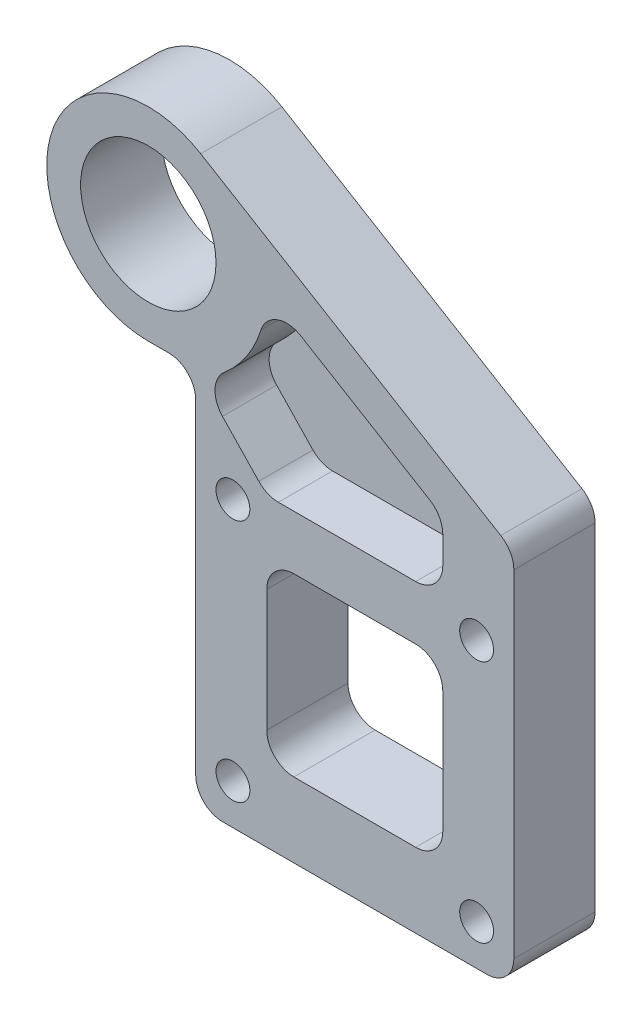
ISO-10303-21;
HEADER;
FILE_DESCRIPTION(('STEP AP214'),'2;1');
FILE_NAME('part.step','',(''),(''),'','','');
FILE_SCHEMA(('AUTOMOTIVE_DESIGN { 1 0 10303 214 1 1 1 1 }'));
ENDSEC;
DATA;
#1=APPLICATION_CONTEXT('core data for automotive mechanical design processes');
#2=APPLICATION_PROTOCOL_DEFINITION('international standard','automotive_design',2000,#1);
#3=PRODUCT_CONTEXT('',#1,'mechanical');
#4=PRODUCT('Part','Part','',(#3));
#5=PRODUCT_RELATED_PRODUCT_CATEGORY('part','',(#4));
#6=PRODUCT_DEFINITION_FORMATION('','',#4);
#7=PRODUCT_DEFINITION_CONTEXT('part definition',#1,'design');
#8=PRODUCT_DEFINITION('design','',#6,#7);
#9=PRODUCT_DEFINITION_SHAPE('','',#8);
#10=(LENGTH_UNIT() NAMED_UNIT(*) SI_UNIT(.MILLI.,.METRE.));
#11=(NAMED_UNIT(*) PLANE_ANGLE_UNIT() SI_UNIT($,.RADIAN.));
#12=(NAMED_UNIT(*) SI_UNIT($,.STERADIAN.) SOLID_ANGLE_UNIT());
#13=UNCERTAINTY_MEASURE_WITH_UNIT(LENGTH_MEASURE(1.E-05),#10,'distance_accuracy_value','');
#14=(GEOMETRIC_REPRESENTATION_CONTEXT(3) GLOBAL_UNCERTAINTY_ASSIGNED_CONTEXT((#13)) GLOBAL_UNIT_ASSIGNED_CONTEXT((#10,
#11,#12)) REPRESENTATION_CONTEXT('',''));
#15=CARTESIAN_POINT('',(0.,0.,0.));
#16=DIRECTION('',(0.,0.,1.));
#17=DIRECTION('',(1.,0.,0.));
#18=AXIS2_PLACEMENT_3D('',#15,#16,#17);
#19=CARTESIAN_POINT('',(0.,0.,6.));
#20=DIRECTION('',(0.,0.,1.));
#21=DIRECTION('',(1.,0.,0.));
#22=AXIS2_PLACEMENT_3D('',#19,#20,#21);
#23=PLANE('',#22);
#24=DIRECTION('',(0.,1.,0.));
#25=VECTOR('',#24,1.);
#26=CARTESIAN_POINT('',(-11.75,0.,6.));
#27=LINE('',#26,#25);
#28=CARTESIAN_POINT('',(-11.75,-10.,6.));
#29=VERTEX_POINT('',#28);
#30=CARTESIAN_POINT('',(-11.75,14.,6.));
#31=VERTEX_POINT('',#30);
#32=EDGE_CURVE('E267',#29,#31,#27,.T.);
#33=ORIENTED_EDGE('',*,*,#32,.F.);
#34=CARTESIAN_POINT('',(-9.75,-10.,6.));
#35=DIRECTION('',(0.,0.,1.));
#36=DIRECTION('',(1.,0.,0.));
#37=AXIS2_PLACEMENT_3D('',#34,#35,#36);
#38=CIRCLE('',#37,2.);
#39=CARTESIAN_POINT('',(-9.75,-12.,6.));
#40=VERTEX_POINT('',#39);
#41=EDGE_CURVE('E388',#29,#40,#38,.T.);
#42=ORIENTED_EDGE('',*,*,#41,.T.);
#43=DIRECTION('',(-1.,0.,0.));
#44=VECTOR('',#43,1.);
#45=CARTESIAN_POINT('',(-11.75,-12.,6.));
#46=LINE('',#45,#44);
#47=CARTESIAN_POINT('',(9.75,-12.,6.));
#48=VERTEX_POINT('',#47);
#49=EDGE_CURVE('E289',#48,#40,#46,.T.);
#50=ORIENTED_EDGE('',*,*,#49,.F.);
#51=CARTESIAN_POINT('',(9.75,-10.,6.));
#52=DIRECTION('',(0.,0.,1.));
#53=DIRECTION('',(1.,0.,0.));
#54=AXIS2_PLACEMENT_3D('',#51,#52,#53);
#55=CIRCLE('',#54,2.);
#56=CARTESIAN_POINT('',(11.75,-10.,6.));
#57=VERTEX_POINT('',#56);
#58=EDGE_CURVE('E385',#48,#57,#55,.T.);
#59=ORIENTED_EDGE('',*,*,#58,.T.);
#60=DIRECTION('',(0.,1.,0.));
#61=VECTOR('',#60,1.);
#62=CARTESIAN_POINT('',(11.75,0.,6.));
#63=LINE('',#62,#61);
#64=CARTESIAN_POINT('',(11.75,14.8695652173913,6.));
#65=VERTEX_POINT('',#64);
#66=EDGE_CURVE('E270',#57,#65,#63,.T.);
#67=ORIENTED_EDGE('',*,*,#66,.T.);
#68=CARTESIAN_POINT('',(9.75,14.8695652173913,6.));
#69=DIRECTION('',(0.,0.,1.));
#70=DIRECTION('',(1.,0.,0.));
#71=AXIS2_PLACEMENT_3D('',#68,#69,#70);
#72=CIRCLE('',#71,2.);
#73=CARTESIAN_POINT('',(10.7815186246418,16.5830322661019,6.));
#74=VERTEX_POINT('',#73);
#75=EDGE_CURVE('E256',#65,#74,#72,.T.);
#76=ORIENTED_EDGE('',*,*,#75,.T.);
#77=DIRECTION('',(0.856733524355301,-0.515759312320917,0.));
#78=VECTOR('',#77,1.);
#79=CARTESIAN_POINT('',(10.1954827957078,16.9358297550923,6.));
#80=LINE('',#79,#78);
#81=CARTESIAN_POINT('',(-11.3818051575931,29.9255014326648,6.));
#82=VERTEX_POINT('',#81);
#83=EDGE_CURVE('E234',#82,#74,#80,.T.);
#84=ORIENTED_EDGE('',*,*,#83,.F.);
#85=CARTESIAN_POINT('',(-15.25,23.5,6.));
#86=DIRECTION('',(0.,0.,1.));
#87=DIRECTION('',(1.,0.,0.));
#88=AXIS2_PLACEMENT_3D('',#85,#86,#87);
#89=CIRCLE('',#88,7.5);
#90=CARTESIAN_POINT('',(-15.25,16.,6.));
#91=VERTEX_POINT('',#90);
#92=EDGE_CURVE('E245',#82,#91,#89,.T.);
#93=ORIENTED_EDGE('',*,*,#92,.T.);
#94=DIRECTION('',(-1.,0.,0.));
#95=VECTOR('',#94,1.);
#96=CARTESIAN_POINT('',(0.,16.,6.));
#97=LINE('',#96,#95);
#98=CARTESIAN_POINT('',(-13.75,16.,6.));
#99=VERTEX_POINT('',#98);
#100=EDGE_CURVE('E250',#99,#91,#97,.T.);
#101=ORIENTED_EDGE('',*,*,#100,.F.);
#102=CARTESIAN_POINT('',(-13.75,14.,6.));
#103=DIRECTION('',(0.,0.,1.));
#104=DIRECTION('',(1.,0.,0.));
#105=AXIS2_PLACEMENT_3D('',#102,#103,#104);
#106=CIRCLE('',#105,2.);
#107=EDGE_CURVE('E11',#99,#31,#106,.F.);
#108=ORIENTED_EDGE('',*,*,#107,.T.);
#109=EDGE_LOOP('',(#33,#42,#50,#59,#67,#76,#84,#93,#101,#108));
#110=FACE_BOUND('',#109,.T.);
#111=DIRECTION('',(0.,1.,0.));
#112=VECTOR('',#111,1.);
#113=CARTESIAN_POINT('',(6.5,-6.5,6.));
#114=LINE('',#113,#112);
#115=CARTESIAN_POINT('',(6.5,-4.5,6.));
#116=VERTEX_POINT('',#115);
#117=CARTESIAN_POINT('',(6.5,4.5,6.));
#118=VERTEX_POINT('',#117);
#119=EDGE_CURVE('E263',#116,#118,#114,.T.);
#120=ORIENTED_EDGE('',*,*,#119,.F.);
#121=CARTESIAN_POINT('',(4.5,-4.5,6.));
#122=DIRECTION('',(0.,0.,1.));
#123=DIRECTION('',(1.,0.,0.));
#124=AXIS2_PLACEMENT_3D('',#121,#122,#123);
#125=CIRCLE('',#124,2.);
#126=CARTESIAN_POINT('',(4.5,-6.5,6.));
#127=VERTEX_POINT('',#126);
#128=EDGE_CURVE('E430',#116,#127,#125,.F.);
#129=ORIENTED_EDGE('',*,*,#128,.T.);
#130=DIRECTION('',(1.,0.,0.));
#131=VECTOR('',#130,1.);
#132=CARTESIAN_POINT('',(-6.5,-6.5,6.));
#133=LINE('',#132,#131);
#134=CARTESIAN_POINT('',(-4.5,-6.5,6.));
#135=VERTEX_POINT('',#134);
#136=EDGE_CURVE('E451',#135,#127,#133,.T.);
#137=ORIENTED_EDGE('',*,*,#136,.F.);
#138=CARTESIAN_POINT('',(-4.5,-4.5,6.));
#139=DIRECTION('',(0.,0.,1.));
#140=DIRECTION('',(1.,0.,0.));
#141=AXIS2_PLACEMENT_3D('',#138,#139,#140);
#142=CIRCLE('',#141,2.);
#143=CARTESIAN_POINT('',(-6.5,-4.5,6.));
#144=VERTEX_POINT('',#143);
#145=EDGE_CURVE('E426',#135,#144,#142,.F.);
#146=ORIENTED_EDGE('',*,*,#145,.T.);
#147=DIRECTION('',(0.,-1.,0.));
#148=VECTOR('',#147,1.);
#149=CARTESIAN_POINT('',(-6.5,-6.5,6.));
#150=LINE('',#149,#148);
#151=CARTESIAN_POINT('',(-6.5,4.49999999999999,6.));
#152=VERTEX_POINT('',#151);
#153=EDGE_CURVE('E455',#152,#144,#150,.T.);
#154=ORIENTED_EDGE('',*,*,#153,.F.);
#155=CARTESIAN_POINT('',(-4.5,4.5,6.));
#156=DIRECTION('',(0.,0.,1.));
#157=DIRECTION('',(1.,0.,0.));
#158=AXIS2_PLACEMENT_3D('',#155,#156,#157);
#159=CIRCLE('',#158,2.);
#160=CARTESIAN_POINT('',(-4.5,6.5,6.));
#161=VERTEX_POINT('',#160);
#162=EDGE_CURVE('E422',#152,#161,#159,.F.);
#163=ORIENTED_EDGE('',*,*,#162,.T.);
#164=DIRECTION('',(-1.,0.,0.));
#165=VECTOR('',#164,1.);
#166=CARTESIAN_POINT('',(-6.5,6.5,6.));
#167=LINE('',#166,#165);
#168=CARTESIAN_POINT('',(4.49999999999999,6.5,6.));
#169=VERTEX_POINT('',#168);
#170=EDGE_CURVE('E459',#169,#161,#167,.T.);
#171=ORIENTED_EDGE('',*,*,#170,.F.);
#172=CARTESIAN_POINT('',(4.5,4.5,6.));
#173=DIRECTION('',(0.,0.,1.));
#174=DIRECTION('',(1.,0.,0.));
#175=AXIS2_PLACEMENT_3D('',#172,#173,#174);
#176=CIRCLE('',#175,2.);
#177=EDGE_CURVE('E418',#169,#118,#176,.F.);
#178=ORIENTED_EDGE('',*,*,#177,.T.);
#179=EDGE_LOOP('',(#120,#129,#137,#146,#154,#163,#171,#178));
#180=FACE_BOUND('',#179,.T.);
#181=CARTESIAN_POINT('',(9.,-9.,6.));
#182=DIRECTION('',(0.,0.,1.));
#183=DIRECTION('',(1.,0.,0.));
#184=AXIS2_PLACEMENT_3D('',#181,#182,#183);
#185=CIRCLE('',#184,1.25);
#186=CARTESIAN_POINT('',(10.25,-9.,6.));
#187=VERTEX_POINT('',#186);
#188=EDGE_CURVE('E272',#187,#187,#185,.T.);
#189=ORIENTED_EDGE('',*,*,#188,.F.);
#190=EDGE_LOOP('',(#189));
#191=FACE_BOUND('',#190,.T.);
#192=CARTESIAN_POINT('',(-9.,-9.,6.));
#193=DIRECTION('',(0.,0.,1.));
#194=DIRECTION('',(1.,0.,0.));
#195=AXIS2_PLACEMENT_3D('',#192,#193,#194);
#196=CIRCLE('',#195,1.25);
#197=CARTESIAN_POINT('',(-7.75,-9.,6.));
#198=VERTEX_POINT('',#197);
#199=EDGE_CURVE('E275',#198,#198,#196,.T.);
#200=ORIENTED_EDGE('',*,*,#199,.F.);
#201=EDGE_LOOP('',(#200));
#202=FACE_BOUND('',#201,.T.);
#203=CARTESIAN_POINT('',(-9.,9.,6.));
#204=DIRECTION('',(0.,0.,1.));
#205=DIRECTION('',(1.,0.,0.));
#206=AXIS2_PLACEMENT_3D('',#203,#204,#205);
#207=CIRCLE('',#206,1.25);
#208=CARTESIAN_POINT('',(-7.75,9.,6.));
#209=VERTEX_POINT('',#208);
#210=EDGE_CURVE('E278',#209,#209,#207,.T.);
#211=ORIENTED_EDGE('',*,*,#210,.F.);
#212=EDGE_LOOP('',(#211));
#213=FACE_BOUND('',#212,.T.);
#214=CARTESIAN_POINT('',(9.,9.,6.));
#215=DIRECTION('',(0.,0.,1.));
#216=DIRECTION('',(1.,0.,0.));
#217=AXIS2_PLACEMENT_3D('',#214,#215,#216);
#218=CIRCLE('',#217,1.25);
#219=CARTESIAN_POINT('',(10.25,9.,6.));
#220=VERTEX_POINT('',#219);
#221=EDGE_CURVE('E281',#220,#220,#218,.T.);
#222=ORIENTED_EDGE('',*,*,#221,.F.);
#223=EDGE_LOOP('',(#222));
#224=FACE_BOUND('',#223,.T.);
#225=CARTESIAN_POINT('',(-15.25,23.5,6.));
#226=DIRECTION('',(0.,0.,1.));
#227=DIRECTION('',(1.,0.,0.));
#228=AXIS2_PLACEMENT_3D('',#225,#226,#227);
#229=CIRCLE('',#228,5.);
#230=CARTESIAN_POINT('',(-10.25,23.5,6.));
#231=VERTEX_POINT('',#230);
#232=EDGE_CURVE('E284',#231,#231,#229,.T.);
#233=ORIENTED_EDGE('',*,*,#232,.F.);
#234=EDGE_LOOP('',(#233));
#235=FACE_BOUND('',#234,.T.);
#236=DIRECTION('',(0.690411098569292,-0.723417248185543,0.));
#237=VECTOR('',#236,1.);
#238=CARTESIAN_POINT('',(1.84261927163919,1.75854916200598,6.));
#239=LINE('',#238,#237);
#240=CARTESIAN_POINT('',(-9.77252149739841,13.9289693505534,6.));
#241=VERTEX_POINT('',#240);
#242=CARTESIAN_POINT('',(-7.09092761218437,11.1191778028614,6.));
#243=VERTEX_POINT('',#242);
#244=EDGE_CURVE('E952',#241,#243,#239,.T.);
#245=ORIENTED_EDGE('',*,*,#244,.F.);
#246=CARTESIAN_POINT('',(-8.32568700102733,15.309791547692,6.));
#247=DIRECTION('',(0.,0.,1.));
#248=DIRECTION('',(1.,0.,0.));
#249=AXIS2_PLACEMENT_3D('',#246,#247,#248);
#250=CIRCLE('',#249,2.);
#251=CARTESIAN_POINT('',(-9.61693418032293,16.83710314719,6.));
#252=VERTEX_POINT('',#251);
#253=EDGE_CURVE('E416',#241,#252,#250,.F.);
#254=ORIENTED_EDGE('',*,*,#253,.T.);
#255=CARTESIAN_POINT('',(-15.25,23.5,6.));
#256=DIRECTION('',(0.,0.,1.));
#257=DIRECTION('',(1.,0.,0.));
#258=AXIS2_PLACEMENT_3D('',#255,#256,#257);
#259=CIRCLE('',#258,8.72499999999999);
#260=CARTESIAN_POINT('',(-6.93196491250515,20.8663870285852,6.));
#261=VERTEX_POINT('',#260);
#262=EDGE_CURVE('E942',#252,#261,#259,.T.);
#263=ORIENTED_EDGE('',*,*,#262,.T.);
#264=CARTESIAN_POINT('',(-5.02525199846622,20.2626935107823,6.));
#265=DIRECTION('',(0.,0.,1.));
#266=DIRECTION('',(1.,0.,0.));
#267=AXIS2_PLACEMENT_3D('',#264,#265,#266);
#268=CIRCLE('',#267,2.);
#269=CARTESIAN_POINT('',(-3.99373337382439,21.9761605594929,6.));
#270=VERTEX_POINT('',#269);
#271=EDGE_CURVE('E414',#261,#270,#268,.F.);
#272=ORIENTED_EDGE('',*,*,#271,.T.);
#273=DIRECTION('',(0.856733524355301,-0.515759312320917,0.));
#274=VECTOR('',#273,1.);
#275=CARTESIAN_POINT('',(8.648204858745,14.3656291820264,6.));
#276=LINE('',#275,#274);
#277=CARTESIAN_POINT('',(5.53151862464183,16.2418951423561,6.));
#278=VERTEX_POINT('',#277);
#279=EDGE_CURVE('E934',#270,#278,#276,.T.);
#280=ORIENTED_EDGE('',*,*,#279,.T.);
#281=CARTESIAN_POINT('',(4.5,14.5284280936455,6.));
#282=DIRECTION('',(0.,0.,1.));
#283=DIRECTION('',(1.,0.,0.));
#284=AXIS2_PLACEMENT_3D('',#281,#282,#283);
#285=CIRCLE('',#284,2.);
#286=CARTESIAN_POINT('',(6.5,14.5284280936455,6.));
#287=VERTEX_POINT('',#286);
#288=EDGE_CURVE('E412',#278,#287,#285,.F.);
#289=ORIENTED_EDGE('',*,*,#288,.T.);
#290=DIRECTION('',(0.,1.,0.));
#291=VECTOR('',#290,1.);
#292=CARTESIAN_POINT('',(6.5,0.,6.));
#293=LINE('',#292,#291);
#294=CARTESIAN_POINT('',(6.5,12.5,6.));
#295=VERTEX_POINT('',#294);
#296=EDGE_CURVE('E945',#295,#287,#293,.T.);
#297=ORIENTED_EDGE('',*,*,#296,.F.);
#298=CARTESIAN_POINT('',(4.5,12.5,6.));
#299=DIRECTION('',(0.,0.,1.));
#300=DIRECTION('',(1.,0.,0.));
#301=AXIS2_PLACEMENT_3D('',#298,#299,#300);
#302=CIRCLE('',#301,2.);
#303=CARTESIAN_POINT('',(4.5,10.5,6.));
#304=VERTEX_POINT('',#303);
#305=EDGE_CURVE('E410',#295,#304,#302,.F.);
#306=ORIENTED_EDGE('',*,*,#305,.T.);
#307=DIRECTION('',(1.,0.,0.));
#308=VECTOR('',#307,1.);
#309=CARTESIAN_POINT('',(0.,10.5,6.));
#310=LINE('',#309,#308);
#311=CARTESIAN_POINT('',(-5.64409311581328,10.5,6.));
#312=VERTEX_POINT('',#311);
#313=EDGE_CURVE('E947',#312,#304,#310,.T.);
#314=ORIENTED_EDGE('',*,*,#313,.F.);
#315=CARTESIAN_POINT('',(-5.64409311581328,12.5,6.));
#316=DIRECTION('',(0.,0.,1.));
#317=DIRECTION('',(1.,0.,0.));
#318=AXIS2_PLACEMENT_3D('',#315,#316,#317);
#319=CIRCLE('',#318,2.);
#320=EDGE_CURVE('E408',#312,#243,#319,.F.);
#321=ORIENTED_EDGE('',*,*,#320,.T.);
#322=EDGE_LOOP('',(#245,#254,#263,#272,#280,#289,#297,#306,#314,#321));
#323=FACE_BOUND('',#322,.T.);
#324=ADVANCED_FACE('F46',(#110,#180,#191,#202,#213,#224,#235,#323),#23,.T.);
#325=CARTESIAN_POINT('',(10.1954827957078,16.9358297550923,6.));
#326=DIRECTION('',(0.515759312320917,0.856733524355301,0.));
#327=DIRECTION('',(-0.856733524355301,0.515759312320917,0.));
#328=AXIS2_PLACEMENT_3D('',#325,#326,#327);
#329=PLANE('',#328);
#330=ORIENTED_EDGE('',*,*,#83,.T.);
#331=DIRECTION('',(0.,0.,-1.));
#332=VECTOR('',#331,1.);
#333=CARTESIAN_POINT('',(10.7815186246418,16.5830322661019,0.));
#334=LINE('',#333,#332);
#335=CARTESIAN_POINT('',(10.7815186246418,16.5830322661019,0.));
#336=VERTEX_POINT('',#335);
#337=EDGE_CURVE('E400',#74,#336,#334,.T.);
#338=ORIENTED_EDGE('',*,*,#337,.T.);
#339=DIRECTION('',(0.856733524355301,-0.515759312320917,0.));
#340=VECTOR('',#339,1.);
#341=CARTESIAN_POINT('',(10.1954827957078,16.9358297550923,0.));
#342=LINE('',#341,#340);
#343=CARTESIAN_POINT('',(-11.3818051575931,29.9255014326648,0.));
#344=VERTEX_POINT('',#343);
#345=EDGE_CURVE('E236',#344,#336,#342,.T.);
#346=ORIENTED_EDGE('',*,*,#345,.F.);
#347=DIRECTION('',(0.,0.,-1.));
#348=VECTOR('',#347,1.);
#349=CARTESIAN_POINT('',(-11.3818051575931,29.9255014326648,6.));
#350=LINE('',#349,#348);
#351=EDGE_CURVE('E230',#82,#344,#350,.T.);
#352=ORIENTED_EDGE('',*,*,#351,.F.);
#353=EDGE_LOOP('',(#330,#338,#346,#352));
#354=FACE_BOUND('',#353,.T.);
#355=ADVANCED_FACE('F232',(#354),#329,.T.);
#356=CARTESIAN_POINT('',(-15.25,23.5,6.));
#357=DIRECTION('',(0.,0.,-1.));
#358=DIRECTION('',(-1.,0.,0.));
#359=AXIS2_PLACEMENT_3D('',#356,#357,#358);
#360=CYLINDRICAL_SURFACE('',#359,7.5);
#361=CARTESIAN_POINT('',(-15.25,23.5,0.));
#362=DIRECTION('',(0.,0.,1.));
#363=DIRECTION('',(1.,0.,0.));
#364=AXIS2_PLACEMENT_3D('',#361,#362,#363);
#365=CIRCLE('',#364,7.5);
#366=CARTESIAN_POINT('',(-15.25,16.,0.));
#367=VERTEX_POINT('',#366);
#368=EDGE_CURVE('E288',#344,#367,#365,.T.);
#369=ORIENTED_EDGE('',*,*,#368,.T.);
#370=DIRECTION('',(0.,0.,-1.));
#371=VECTOR('',#370,1.);
#372=CARTESIAN_POINT('',(-15.25,16.,6.));
#373=LINE('',#372,#371);
#374=EDGE_CURVE('E241',#91,#367,#373,.T.);
#375=ORIENTED_EDGE('',*,*,#374,.F.);
#376=ORIENTED_EDGE('',*,*,#92,.F.);
#377=ORIENTED_EDGE('',*,*,#351,.T.);
#378=EDGE_LOOP('',(#369,#375,#376,#377));
#379=FACE_BOUND('',#378,.T.);
#380=ADVANCED_FACE('F246',(#379),#360,.T.);
#381=CARTESIAN_POINT('',(0.,16.,6.));
#382=DIRECTION('',(0.,-1.,0.));
#383=DIRECTION('',(1.,0.,0.));
#384=AXIS2_PLACEMENT_3D('',#381,#382,#383);
#385=PLANE('',#384);
#386=DIRECTION('',(-1.,0.,0.));
#387=VECTOR('',#386,1.);
#388=CARTESIAN_POINT('',(0.,16.,0.));
#389=LINE('',#388,#387);
#390=CARTESIAN_POINT('',(-13.75,16.,0.));
#391=VERTEX_POINT('',#390);
#392=EDGE_CURVE('E291',#391,#367,#389,.T.);
#393=ORIENTED_EDGE('',*,*,#392,.F.);
#394=DIRECTION('',(0.,0.,-1.));
#395=VECTOR('',#394,1.);
#396=CARTESIAN_POINT('',(-13.75,16.,6.));
#397=LINE('',#396,#395);
#398=EDGE_CURVE('E406',#391,#99,#397,.F.);
#399=ORIENTED_EDGE('',*,*,#398,.T.);
#400=ORIENTED_EDGE('',*,*,#100,.T.);
#401=ORIENTED_EDGE('',*,*,#374,.T.);
#402=EDGE_LOOP('',(#393,#399,#400,#401));
#403=FACE_BOUND('',#402,.T.);
#404=ADVANCED_FACE('F490',(#403),#385,.T.);
#405=CARTESIAN_POINT('',(-11.75,0.,6.));
#406=DIRECTION('',(-1.,0.,0.));
#407=DIRECTION('',(0.,0.,1.));
#408=AXIS2_PLACEMENT_3D('',#405,#406,#407);
#409=PLANE('',#408);
#410=DIRECTION('',(0.,1.,0.));
#411=VECTOR('',#410,1.);
#412=CARTESIAN_POINT('',(-11.75,0.,0.));
#413=LINE('',#412,#411);
#414=CARTESIAN_POINT('',(-11.75,-10.,0.));
#415=VERTEX_POINT('',#414);
#416=CARTESIAN_POINT('',(-11.75,14.,0.));
#417=VERTEX_POINT('',#416);
#418=EDGE_CURVE('E293',#415,#417,#413,.T.);
#419=ORIENTED_EDGE('',*,*,#418,.F.);
#420=DIRECTION('',(0.,0.,1.));
#421=VECTOR('',#420,1.);
#422=CARTESIAN_POINT('',(-11.75,-10.,6.));
#423=LINE('',#422,#421);
#424=EDGE_CURVE('E382',#415,#29,#423,.T.);
#425=ORIENTED_EDGE('',*,*,#424,.T.);
#426=ORIENTED_EDGE('',*,*,#32,.T.);
#427=DIRECTION('',(0.,0.,-1.));
#428=VECTOR('',#427,1.);
#429=CARTESIAN_POINT('',(-11.75,14.,0.));
#430=LINE('',#429,#428);
#431=EDGE_CURVE('E379',#31,#417,#430,.T.);
#432=ORIENTED_EDGE('',*,*,#431,.T.);
#433=EDGE_LOOP('',(#419,#425,#426,#432));
#434=FACE_BOUND('',#433,.T.);
#435=ADVANCED_FACE('F484',(#434),#409,.T.);
#436=CARTESIAN_POINT('',(9.,9.,6.));
#437=DIRECTION('',(0.,0.,-1.));
#438=DIRECTION('',(-1.,0.,0.));
#439=AXIS2_PLACEMENT_3D('',#436,#437,#438);
#440=CYLINDRICAL_SURFACE('',#439,1.25);
#441=ORIENTED_EDGE('',*,*,#221,.T.);
#442=EDGE_LOOP('',(#441));
#443=FACE_BOUND('',#442,.T.);
#444=CARTESIAN_POINT('',(9.,9.,0.));
#445=DIRECTION('',(0.,0.,1.));
#446=DIRECTION('',(1.,0.,0.));
#447=AXIS2_PLACEMENT_3D('',#444,#445,#446);
#448=CIRCLE('',#447,1.25);
#449=CARTESIAN_POINT('',(10.25,9.,0.));
#450=VERTEX_POINT('',#449);
#451=EDGE_CURVE('E260',#450,#450,#448,.T.);
#452=ORIENTED_EDGE('',*,*,#451,.F.);
#453=EDGE_LOOP('',(#452));
#454=FACE_BOUND('',#453,.T.);
#455=ADVANCED_FACE('F522',(#443,#454),#440,.F.);
#456=CARTESIAN_POINT('',(-9.,9.,6.));
#457=DIRECTION('',(0.,0.,-1.));
#458=DIRECTION('',(-1.,0.,0.));
#459=AXIS2_PLACEMENT_3D('',#456,#457,#458);
#460=CYLINDRICAL_SURFACE('',#459,1.25);
#461=ORIENTED_EDGE('',*,*,#210,.T.);
#462=EDGE_LOOP('',(#461));
#463=FACE_BOUND('',#462,.T.);
#464=CARTESIAN_POINT('',(-9.,9.,0.));
#465=DIRECTION('',(0.,0.,1.));
#466=DIRECTION('',(1.,0.,0.));
#467=AXIS2_PLACEMENT_3D('',#464,#465,#466);
#468=CIRCLE('',#467,1.25);
#469=CARTESIAN_POINT('',(-7.75,9.,0.));
#470=VERTEX_POINT('',#469);
#471=EDGE_CURVE('E304',#470,#470,#468,.T.);
#472=ORIENTED_EDGE('',*,*,#471,.F.);
#473=EDGE_LOOP('',(#472));
#474=FACE_BOUND('',#473,.T.);
#475=ADVANCED_FACE('F525',(#463,#474),#460,.F.);
#476=CARTESIAN_POINT('',(-9.,-9.,6.));
#477=DIRECTION('',(0.,0.,-1.));
#478=DIRECTION('',(-1.,0.,0.));
#479=AXIS2_PLACEMENT_3D('',#476,#477,#478);
#480=CYLINDRICAL_SURFACE('',#479,1.25);
#481=ORIENTED_EDGE('',*,*,#199,.T.);
#482=EDGE_LOOP('',(#481));
#483=FACE_BOUND('',#482,.T.);
#484=CARTESIAN_POINT('',(-9.,-9.,0.));
#485=DIRECTION('',(0.,0.,1.));
#486=DIRECTION('',(1.,0.,0.));
#487=AXIS2_PLACEMENT_3D('',#484,#485,#486);
#488=CIRCLE('',#487,1.25);
#489=CARTESIAN_POINT('',(-7.75,-9.,0.));
#490=VERTEX_POINT('',#489);
#491=EDGE_CURVE('E301',#490,#490,#488,.T.);
#492=ORIENTED_EDGE('',*,*,#491,.F.);
#493=EDGE_LOOP('',(#492));
#494=FACE_BOUND('',#493,.T.);
#495=ADVANCED_FACE('F529',(#483,#494),#480,.F.);
#496=CARTESIAN_POINT('',(9.,-9.,6.));
#497=DIRECTION('',(0.,0.,-1.));
#498=DIRECTION('',(-1.,0.,0.));
#499=AXIS2_PLACEMENT_3D('',#496,#497,#498);
#500=CYLINDRICAL_SURFACE('',#499,1.25);
#501=ORIENTED_EDGE('',*,*,#188,.T.);
#502=EDGE_LOOP('',(#501));
#503=FACE_BOUND('',#502,.T.);
#504=CARTESIAN_POINT('',(9.,-9.,0.));
#505=DIRECTION('',(0.,0.,1.));
#506=DIRECTION('',(1.,0.,0.));
#507=AXIS2_PLACEMENT_3D('',#504,#505,#506);
#508=CIRCLE('',#507,1.25);
#509=CARTESIAN_POINT('',(10.25,-9.,0.));
#510=VERTEX_POINT('',#509);
#511=EDGE_CURVE('E298',#510,#510,#508,.T.);
#512=ORIENTED_EDGE('',*,*,#511,.F.);
#513=EDGE_LOOP('',(#512));
#514=FACE_BOUND('',#513,.T.);
#515=ADVANCED_FACE('F533',(#503,#514),#500,.F.);
#516=CARTESIAN_POINT('',(11.75,0.,6.));
#517=DIRECTION('',(-1.,0.,0.));
#518=DIRECTION('',(0.,0.,1.));
#519=AXIS2_PLACEMENT_3D('',#516,#517,#518);
#520=PLANE('',#519);
#521=DIRECTION('',(0.,1.,0.));
#522=VECTOR('',#521,1.);
#523=CARTESIAN_POINT('',(11.75,0.,0.));
#524=LINE('',#523,#522);
#525=CARTESIAN_POINT('',(11.75,-10.,0.));
#526=VERTEX_POINT('',#525);
#527=CARTESIAN_POINT('',(11.75,14.8695652173913,0.));
#528=VERTEX_POINT('',#527);
#529=EDGE_CURVE('E295',#526,#528,#524,.T.);
#530=ORIENTED_EDGE('',*,*,#529,.T.);
#531=DIRECTION('',(0.,0.,-1.));
#532=VECTOR('',#531,1.);
#533=CARTESIAN_POINT('',(11.75,14.8695652173913,6.));
#534=LINE('',#533,#532);
#535=EDGE_CURVE('E404',#528,#65,#534,.F.);
#536=ORIENTED_EDGE('',*,*,#535,.T.);
#537=ORIENTED_EDGE('',*,*,#66,.F.);
#538=DIRECTION('',(0.,0.,1.));
#539=VECTOR('',#538,1.);
#540=CARTESIAN_POINT('',(11.75,-10.,6.));
#541=LINE('',#540,#539);
#542=EDGE_CURVE('E402',#57,#526,#541,.F.);
#543=ORIENTED_EDGE('',*,*,#542,.T.);
#544=EDGE_LOOP('',(#530,#536,#537,#543));
#545=FACE_BOUND('',#544,.T.);
#546=ADVANCED_FACE('F494',(#545),#520,.F.);
#547=CARTESIAN_POINT('',(-15.25,23.5,6.));
#548=DIRECTION('',(0.,0.,-1.));
#549=DIRECTION('',(-1.,0.,0.));
#550=AXIS2_PLACEMENT_3D('',#547,#548,#549);
#551=CYLINDRICAL_SURFACE('',#550,5.);
#552=ORIENTED_EDGE('',*,*,#232,.T.);
#553=EDGE_LOOP('',(#552));
#554=FACE_BOUND('',#553,.T.);
#555=CARTESIAN_POINT('',(-15.25,23.5,0.));
#556=DIRECTION('',(0.,0.,1.));
#557=DIRECTION('',(1.,0.,0.));
#558=AXIS2_PLACEMENT_3D('',#555,#556,#557);
#559=CIRCLE('',#558,5.);
#560=CARTESIAN_POINT('',(-10.25,23.5,0.));
#561=VERTEX_POINT('',#560);
#562=EDGE_CURVE('E257',#561,#561,#559,.T.);
#563=ORIENTED_EDGE('',*,*,#562,.F.);
#564=EDGE_LOOP('',(#563));
#565=FACE_BOUND('',#564,.T.);
#566=ADVANCED_FACE('F518',(#554,#565),#551,.F.);
#567=CARTESIAN_POINT('',(0.,0.,0.));
#568=DIRECTION('',(0.,0.,1.));
#569=DIRECTION('',(1.,0.,0.));
#570=AXIS2_PLACEMENT_3D('',#567,#568,#569);
#571=PLANE('',#570);
#572=DIRECTION('',(0.,-1.,0.));
#573=VECTOR('',#572,1.);
#574=CARTESIAN_POINT('',(-6.5,0.,0.));
#575=LINE('',#574,#573);
#576=CARTESIAN_POINT('',(-6.5,4.5,0.));
#577=VERTEX_POINT('',#576);
#578=CARTESIAN_POINT('',(-6.5,-4.5,0.));
#579=VERTEX_POINT('',#578);
#580=EDGE_CURVE('E312',#577,#579,#575,.T.);
#581=ORIENTED_EDGE('',*,*,#580,.T.);
#582=CARTESIAN_POINT('',(-4.5,-4.5,0.));
#583=DIRECTION('',(0.,0.,1.));
#584=DIRECTION('',(1.,0.,0.));
#585=AXIS2_PLACEMENT_3D('',#582,#583,#584);
#586=CIRCLE('',#585,2.);
#587=CARTESIAN_POINT('',(-4.5,-6.5,0.));
#588=VERTEX_POINT('',#587);
#589=EDGE_CURVE('E428',#579,#588,#586,.T.);
#590=ORIENTED_EDGE('',*,*,#589,.T.);
#591=DIRECTION('',(1.,0.,0.));
#592=VECTOR('',#591,1.);
#593=CARTESIAN_POINT('',(0.,-6.5,0.));
#594=LINE('',#593,#592);
#595=CARTESIAN_POINT('',(4.5,-6.5,0.));
#596=VERTEX_POINT('',#595);
#597=EDGE_CURVE('E315',#588,#596,#594,.T.);
#598=ORIENTED_EDGE('',*,*,#597,.T.);
#599=CARTESIAN_POINT('',(4.5,-4.5,0.));
#600=DIRECTION('',(0.,0.,1.));
#601=DIRECTION('',(1.,0.,0.));
#602=AXIS2_PLACEMENT_3D('',#599,#600,#601);
#603=CIRCLE('',#602,2.);
#604=CARTESIAN_POINT('',(6.5,-4.5,0.));
#605=VERTEX_POINT('',#604);
#606=EDGE_CURVE('E432',#596,#605,#603,.T.);
#607=ORIENTED_EDGE('',*,*,#606,.T.);
#608=DIRECTION('',(0.,1.,0.));
#609=VECTOR('',#608,1.);
#610=CARTESIAN_POINT('',(6.5,0.,0.));
#611=LINE('',#610,#609);
#612=CARTESIAN_POINT('',(6.5,4.5,0.));
#613=VERTEX_POINT('',#612);
#614=EDGE_CURVE('E318',#605,#613,#611,.T.);
#615=ORIENTED_EDGE('',*,*,#614,.T.);
#616=CARTESIAN_POINT('',(4.5,4.5,0.));
#617=DIRECTION('',(0.,0.,1.));
#618=DIRECTION('',(1.,0.,0.));
#619=AXIS2_PLACEMENT_3D('',#616,#617,#618);
#620=CIRCLE('',#619,2.);
#621=CARTESIAN_POINT('',(4.5,6.5,0.));
#622=VERTEX_POINT('',#621);
#623=EDGE_CURVE('E420',#613,#622,#620,.T.);
#624=ORIENTED_EDGE('',*,*,#623,.T.);
#625=DIRECTION('',(-1.,0.,0.));
#626=VECTOR('',#625,1.);
#627=CARTESIAN_POINT('',(0.,6.5,0.));
#628=LINE('',#627,#626);
#629=CARTESIAN_POINT('',(-4.5,6.5,0.));
#630=VERTEX_POINT('',#629);
#631=EDGE_CURVE('E240',#622,#630,#628,.T.);
#632=ORIENTED_EDGE('',*,*,#631,.T.);
#633=CARTESIAN_POINT('',(-4.5,4.5,0.));
#634=DIRECTION('',(0.,0.,1.));
#635=DIRECTION('',(1.,0.,0.));
#636=AXIS2_PLACEMENT_3D('',#633,#634,#635);
#637=CIRCLE('',#636,2.);
#638=EDGE_CURVE('E424',#630,#577,#637,.T.);
#639=ORIENTED_EDGE('',*,*,#638,.T.);
#640=EDGE_LOOP('',(#581,#590,#598,#607,#615,#624,#632,#639));
#641=FACE_BOUND('',#640,.T.);
#642=DIRECTION('',(-1.,0.,0.));
#643=VECTOR('',#642,1.);
#644=CARTESIAN_POINT('',(0.,-12.,0.));
#645=LINE('',#644,#643);
#646=CARTESIAN_POINT('',(9.75,-12.,0.));
#647=VERTEX_POINT('',#646);
#648=CARTESIAN_POINT('',(-9.75,-12.,0.));
#649=VERTEX_POINT('',#648);
#650=EDGE_CURVE('E321',#647,#649,#645,.T.);
#651=ORIENTED_EDGE('',*,*,#650,.T.);
#652=CARTESIAN_POINT('',(-9.75,-10.,0.));
#653=DIRECTION('',(0.,0.,1.));
#654=DIRECTION('',(1.,0.,0.));
#655=AXIS2_PLACEMENT_3D('',#652,#653,#654);
#656=CIRCLE('',#655,2.);
#657=EDGE_CURVE('E398',#649,#415,#656,.F.);
#658=ORIENTED_EDGE('',*,*,#657,.T.);
#659=ORIENTED_EDGE('',*,*,#418,.T.);
#660=CARTESIAN_POINT('',(-13.75,14.,0.));
#661=DIRECTION('',(0.,0.,1.));
#662=DIRECTION('',(1.,0.,0.));
#663=AXIS2_PLACEMENT_3D('',#660,#661,#662);
#664=CIRCLE('',#663,2.);
#665=EDGE_CURVE('E54',#417,#391,#664,.T.);
#666=ORIENTED_EDGE('',*,*,#665,.T.);
#667=ORIENTED_EDGE('',*,*,#392,.T.);
#668=ORIENTED_EDGE('',*,*,#368,.F.);
#669=ORIENTED_EDGE('',*,*,#345,.T.);
#670=CARTESIAN_POINT('',(9.75,14.8695652173913,0.));
#671=DIRECTION('',(0.,0.,1.));
#672=DIRECTION('',(1.,0.,0.));
#673=AXIS2_PLACEMENT_3D('',#670,#671,#672);
#674=CIRCLE('',#673,2.);
#675=EDGE_CURVE('E61',#336,#528,#674,.F.);
#676=ORIENTED_EDGE('',*,*,#675,.T.);
#677=ORIENTED_EDGE('',*,*,#529,.F.);
#678=CARTESIAN_POINT('',(9.75,-10.,0.));
#679=DIRECTION('',(0.,0.,1.));
#680=DIRECTION('',(1.,0.,0.));
#681=AXIS2_PLACEMENT_3D('',#678,#679,#680);
#682=CIRCLE('',#681,2.);
#683=EDGE_CURVE('E395',#526,#647,#682,.F.);
#684=ORIENTED_EDGE('',*,*,#683,.T.);
#685=EDGE_LOOP('',(#651,#658,#659,#666,#667,#668,#669,#676,#677,#684));
#686=FACE_BOUND('',#685,.T.);
#687=ORIENTED_EDGE('',*,*,#511,.T.);
#688=EDGE_LOOP('',(#687));
#689=FACE_BOUND('',#688,.T.);
#690=ORIENTED_EDGE('',*,*,#491,.T.);
#691=EDGE_LOOP('',(#690));
#692=FACE_BOUND('',#691,.T.);
#693=ORIENTED_EDGE('',*,*,#471,.T.);
#694=EDGE_LOOP('',(#693));
#695=FACE_BOUND('',#694,.T.);
#696=ORIENTED_EDGE('',*,*,#451,.T.);
#697=EDGE_LOOP('',(#696));
#698=FACE_BOUND('',#697,.T.);
#699=ORIENTED_EDGE('',*,*,#562,.T.);
#700=EDGE_LOOP('',(#699));
#701=FACE_BOUND('',#700,.T.);
#702=ADVANCED_FACE('F436',(#641,#686,#689,#692,#695,#698,#701),#571,.F.);
#703=CARTESIAN_POINT('',(6.5,-6.5,-1.));
#704=DIRECTION('',(1.,0.,0.));
#705=DIRECTION('',(0.,0.,-1.));
#706=AXIS2_PLACEMENT_3D('',#703,#704,#705);
#707=PLANE('',#706);
#708=ORIENTED_EDGE('',*,*,#119,.T.);
#709=DIRECTION('',(0.,0.,1.));
#710=VECTOR('',#709,1.);
#711=CARTESIAN_POINT('',(6.5,4.5,0.));
#712=LINE('',#711,#710);
#713=EDGE_CURVE('E367',#118,#613,#712,.F.);
#714=ORIENTED_EDGE('',*,*,#713,.T.);
#715=ORIENTED_EDGE('',*,*,#614,.F.);
#716=DIRECTION('',(0.,0.,1.));
#717=VECTOR('',#716,1.);
#718=CARTESIAN_POINT('',(6.5,-4.5,6.));
#719=LINE('',#718,#717);
#720=EDGE_CURVE('E364',#605,#116,#719,.T.);
#721=ORIENTED_EDGE('',*,*,#720,.T.);
#722=EDGE_LOOP('',(#708,#714,#715,#721));
#723=FACE_BOUND('',#722,.T.);
#724=ADVANCED_FACE('F444',(#723),#707,.F.);
#725=CARTESIAN_POINT('',(-6.5,-6.5,-1.));
#726=DIRECTION('',(0.,-1.,0.));
#727=DIRECTION('',(0.,0.,-1.));
#728=AXIS2_PLACEMENT_3D('',#725,#726,#727);
#729=PLANE('',#728);
#730=ORIENTED_EDGE('',*,*,#597,.F.);
#731=DIRECTION('',(0.,0.,1.));
#732=VECTOR('',#731,1.);
#733=CARTESIAN_POINT('',(-4.5,-6.5,6.));
#734=LINE('',#733,#732);
#735=EDGE_CURVE('E376',#588,#135,#734,.T.);
#736=ORIENTED_EDGE('',*,*,#735,.T.);
#737=ORIENTED_EDGE('',*,*,#136,.T.);
#738=DIRECTION('',(0.,0.,1.));
#739=VECTOR('',#738,1.);
#740=CARTESIAN_POINT('',(4.5,-6.5,0.));
#741=LINE('',#740,#739);
#742=EDGE_CURVE('E374',#127,#596,#741,.F.);
#743=ORIENTED_EDGE('',*,*,#742,.T.);
#744=EDGE_LOOP('',(#730,#736,#737,#743));
#745=FACE_BOUND('',#744,.T.);
#746=ADVANCED_FACE('F453',(#745),#729,.F.);
#747=CARTESIAN_POINT('',(-6.5,-6.5,-1.));
#748=DIRECTION('',(-1.,0.,0.));
#749=DIRECTION('',(0.,0.,1.));
#750=AXIS2_PLACEMENT_3D('',#747,#748,#749);
#751=PLANE('',#750);
#752=ORIENTED_EDGE('',*,*,#580,.F.);
#753=DIRECTION('',(0.,0.,1.));
#754=VECTOR('',#753,1.);
#755=CARTESIAN_POINT('',(-6.5,4.5,6.));
#756=LINE('',#755,#754);
#757=EDGE_CURVE('E371',#577,#152,#756,.T.);
#758=ORIENTED_EDGE('',*,*,#757,.T.);
#759=ORIENTED_EDGE('',*,*,#153,.T.);
#760=DIRECTION('',(0.,0.,1.));
#761=VECTOR('',#760,1.);
#762=CARTESIAN_POINT('',(-6.5,-4.5,0.));
#763=LINE('',#762,#761);
#764=EDGE_CURVE('E369',#144,#579,#763,.F.);
#765=ORIENTED_EDGE('',*,*,#764,.T.);
#766=EDGE_LOOP('',(#752,#758,#759,#765));
#767=FACE_BOUND('',#766,.T.);
#768=ADVANCED_FACE('F751',(#767),#751,.F.);
#769=CARTESIAN_POINT('',(-6.5,6.5,-1.));
#770=DIRECTION('',(0.,1.,0.));
#771=DIRECTION('',(0.,0.,1.));
#772=AXIS2_PLACEMENT_3D('',#769,#770,#771);
#773=PLANE('',#772);
#774=ORIENTED_EDGE('',*,*,#631,.F.);
#775=DIRECTION('',(0.,0.,1.));
#776=VECTOR('',#775,1.);
#777=CARTESIAN_POINT('',(4.5,6.5,6.));
#778=LINE('',#777,#776);
#779=EDGE_CURVE('E361',#622,#169,#778,.T.);
#780=ORIENTED_EDGE('',*,*,#779,.T.);
#781=ORIENTED_EDGE('',*,*,#170,.T.);
#782=DIRECTION('',(0.,0.,1.));
#783=VECTOR('',#782,1.);
#784=CARTESIAN_POINT('',(-4.5,6.5,0.));
#785=LINE('',#784,#783);
#786=EDGE_CURVE('E359',#161,#630,#785,.F.);
#787=ORIENTED_EDGE('',*,*,#786,.T.);
#788=EDGE_LOOP('',(#774,#780,#781,#787));
#789=FACE_BOUND('',#788,.T.);
#790=ADVANCED_FACE('F741',(#789),#773,.F.);
#791=CARTESIAN_POINT('',(-11.75,-12.,-1.));
#792=DIRECTION('',(0.,1.,0.));
#793=DIRECTION('',(0.,0.,1.));
#794=AXIS2_PLACEMENT_3D('',#791,#792,#793);
#795=PLANE('',#794);
#796=ORIENTED_EDGE('',*,*,#49,.T.);
#797=DIRECTION('',(0.,0.,1.));
#798=VECTOR('',#797,1.);
#799=CARTESIAN_POINT('',(-9.75,-12.,0.));
#800=LINE('',#799,#798);
#801=EDGE_CURVE('E393',#40,#649,#800,.F.);
#802=ORIENTED_EDGE('',*,*,#801,.T.);
#803=ORIENTED_EDGE('',*,*,#650,.F.);
#804=DIRECTION('',(0.,0.,1.));
#805=VECTOR('',#804,1.);
#806=CARTESIAN_POINT('',(9.75,-12.,-1.));
#807=LINE('',#806,#805);
#808=EDGE_CURVE('E390',#647,#48,#807,.T.);
#809=ORIENTED_EDGE('',*,*,#808,.T.);
#810=EDGE_LOOP('',(#796,#802,#803,#809));
#811=FACE_BOUND('',#810,.T.);
#812=ADVANCED_FACE('F474',(#811),#795,.F.);
#813=CARTESIAN_POINT('',(-15.25,23.5,2.));
#814=DIRECTION('',(0.,0.,1.));
#815=DIRECTION('',(1.,0.,0.));
#816=AXIS2_PLACEMENT_3D('',#813,#814,#815);
#817=CYLINDRICAL_SURFACE('',#816,8.72499999999999);
#818=CARTESIAN_POINT('',(-15.25,23.5,2.));
#819=DIRECTION('',(0.,0.,1.));
#820=DIRECTION('',(1.,0.,0.));
#821=AXIS2_PLACEMENT_3D('',#818,#819,#820);
#822=CIRCLE('',#821,8.72499999999999);
#823=CARTESIAN_POINT('',(-9.61693418032293,16.83710314719,2.));
#824=VERTEX_POINT('',#823);
#825=CARTESIAN_POINT('',(-6.93196491250515,20.8663870285852,2.));
#826=VERTEX_POINT('',#825);
#827=EDGE_CURVE('E927',#824,#826,#822,.T.);
#828=ORIENTED_EDGE('',*,*,#827,.T.);
#829=DIRECTION('',(0.,0.,1.));
#830=VECTOR('',#829,1.);
#831=CARTESIAN_POINT('',(-6.93196491250515,20.8663870285852,2.));
#832=LINE('',#831,#830);
#833=EDGE_CURVE('E356',#826,#261,#832,.T.);
#834=ORIENTED_EDGE('',*,*,#833,.T.);
#835=ORIENTED_EDGE('',*,*,#262,.F.);
#836=DIRECTION('',(0.,0.,1.));
#837=VECTOR('',#836,1.);
#838=CARTESIAN_POINT('',(-9.61693418032293,16.83710314719,2.));
#839=LINE('',#838,#837);
#840=EDGE_CURVE('E354',#252,#824,#839,.F.);
#841=ORIENTED_EDGE('',*,*,#840,.T.);
#842=EDGE_LOOP('',(#828,#834,#835,#841));
#843=FACE_BOUND('',#842,.T.);
#844=ADVANCED_FACE('F713',(#843),#817,.T.);
#845=CARTESIAN_POINT('',(8.648204858745,14.3656291820264,2.));
#846=DIRECTION('',(-0.515759312320917,-0.856733524355301,0.));
#847=DIRECTION('',(0.856733524355301,-0.515759312320917,0.));
#848=AXIS2_PLACEMENT_3D('',#845,#846,#847);
#849=PLANE('',#848);
#850=DIRECTION('',(0.856733524355301,-0.515759312320917,0.));
#851=VECTOR('',#850,1.);
#852=CARTESIAN_POINT('',(8.648204858745,14.3656291820264,2.));
#853=LINE('',#852,#851);
#854=CARTESIAN_POINT('',(-3.99373337382439,21.9761605594929,2.));
#855=VERTEX_POINT('',#854);
#856=CARTESIAN_POINT('',(5.53151862464183,16.2418951423561,2.));
#857=VERTEX_POINT('',#856);
#858=EDGE_CURVE('E456',#855,#857,#853,.T.);
#859=ORIENTED_EDGE('',*,*,#858,.T.);
#860=DIRECTION('',(0.,0.,1.));
#861=VECTOR('',#860,1.);
#862=CARTESIAN_POINT('',(5.53151862464183,16.2418951423561,2.));
#863=LINE('',#862,#861);
#864=EDGE_CURVE('E351',#857,#278,#863,.T.);
#865=ORIENTED_EDGE('',*,*,#864,.T.);
#866=ORIENTED_EDGE('',*,*,#279,.F.);
#867=DIRECTION('',(0.,0.,-1.));
#868=VECTOR('',#867,1.);
#869=CARTESIAN_POINT('',(-3.99373337382438,21.9761605594929,2.));
#870=LINE('',#869,#868);
#871=EDGE_CURVE('E349',#270,#855,#870,.T.);
#872=ORIENTED_EDGE('',*,*,#871,.T.);
#873=EDGE_LOOP('',(#859,#865,#866,#872));
#874=FACE_BOUND('',#873,.T.);
#875=ADVANCED_FACE('F703',(#874),#849,.T.);
#876=CARTESIAN_POINT('',(6.5,0.,2.));
#877=DIRECTION('',(1.,0.,0.));
#878=DIRECTION('',(0.,0.,-1.));
#879=AXIS2_PLACEMENT_3D('',#876,#877,#878);
#880=PLANE('',#879);
#881=DIRECTION('',(0.,1.,0.));
#882=VECTOR('',#881,1.);
#883=CARTESIAN_POINT('',(6.5,0.,2.));
#884=LINE('',#883,#882);
#885=CARTESIAN_POINT('',(6.5,12.5,2.));
#886=VERTEX_POINT('',#885);
#887=CARTESIAN_POINT('',(6.5,14.5284280936455,2.));
#888=VERTEX_POINT('',#887);
#889=EDGE_CURVE('E462',#886,#888,#884,.T.);
#890=ORIENTED_EDGE('',*,*,#889,.F.);
#891=DIRECTION('',(0.,0.,1.));
#892=VECTOR('',#891,1.);
#893=CARTESIAN_POINT('',(6.5,12.5,6.));
#894=LINE('',#893,#892);
#895=EDGE_CURVE('E346',#886,#295,#894,.T.);
#896=ORIENTED_EDGE('',*,*,#895,.T.);
#897=ORIENTED_EDGE('',*,*,#296,.T.);
#898=DIRECTION('',(0.,0.,1.));
#899=VECTOR('',#898,1.);
#900=CARTESIAN_POINT('',(6.5,14.5284280936455,2.));
#901=LINE('',#900,#899);
#902=EDGE_CURVE('E344',#287,#888,#901,.F.);
#903=ORIENTED_EDGE('',*,*,#902,.T.);
#904=EDGE_LOOP('',(#890,#896,#897,#903));
#905=FACE_BOUND('',#904,.T.);
#906=ADVANCED_FACE('F693',(#905),#880,.F.);
#907=CARTESIAN_POINT('',(0.,10.5,2.));
#908=DIRECTION('',(0.,-1.,0.));
#909=DIRECTION('',(0.,0.,-1.));
#910=AXIS2_PLACEMENT_3D('',#907,#908,#909);
#911=PLANE('',#910);
#912=DIRECTION('',(1.,0.,0.));
#913=VECTOR('',#912,1.);
#914=CARTESIAN_POINT('',(0.,10.5,2.));
#915=LINE('',#914,#913);
#916=CARTESIAN_POINT('',(-5.64409311581328,10.5,2.));
#917=VERTEX_POINT('',#916);
#918=CARTESIAN_POINT('',(4.5,10.5,2.));
#919=VERTEX_POINT('',#918);
#920=EDGE_CURVE('E958',#917,#919,#915,.T.);
#921=ORIENTED_EDGE('',*,*,#920,.F.);
#922=DIRECTION('',(0.,0.,1.));
#923=VECTOR('',#922,1.);
#924=CARTESIAN_POINT('',(-5.64409311581328,10.5,6.));
#925=LINE('',#924,#923);
#926=EDGE_CURVE('E326',#917,#312,#925,.T.);
#927=ORIENTED_EDGE('',*,*,#926,.T.);
#928=ORIENTED_EDGE('',*,*,#313,.T.);
#929=DIRECTION('',(0.,0.,1.));
#930=VECTOR('',#929,1.);
#931=CARTESIAN_POINT('',(4.5,10.5,2.));
#932=LINE('',#931,#930);
#933=EDGE_CURVE('E324',#304,#919,#932,.F.);
#934=ORIENTED_EDGE('',*,*,#933,.T.);
#935=EDGE_LOOP('',(#921,#927,#928,#934));
#936=FACE_BOUND('',#935,.T.);
#937=ADVANCED_FACE('F683',(#936),#911,.F.);
#938=CARTESIAN_POINT('',(1.84261927163919,1.75854916200598,2.));
#939=DIRECTION('',(-0.723417248185543,-0.690411098569292,0.));
#940=DIRECTION('',(0.690411098569292,-0.723417248185543,0.));
#941=AXIS2_PLACEMENT_3D('',#938,#939,#940);
#942=PLANE('',#941);
#943=ORIENTED_EDGE('',*,*,#244,.T.);
#944=DIRECTION('',(0.,0.,1.));
#945=VECTOR('',#944,1.);
#946=CARTESIAN_POINT('',(-7.09092761218437,11.1191778028614,2.));
#947=LINE('',#946,#945);
#948=CARTESIAN_POINT('',(-7.09092761218437,11.1191778028614,2.));
#949=VERTEX_POINT('',#948);
#950=EDGE_CURVE('E332',#243,#949,#947,.F.);
#951=ORIENTED_EDGE('',*,*,#950,.T.);
#952=DIRECTION('',(0.690411098569292,-0.723417248185543,0.));
#953=VECTOR('',#952,1.);
#954=CARTESIAN_POINT('',(1.84261927163919,1.75854916200598,2.));
#955=LINE('',#954,#953);
#956=CARTESIAN_POINT('',(-9.77252149739841,13.9289693505534,2.));
#957=VERTEX_POINT('',#956);
#958=EDGE_CURVE('E933',#957,#949,#955,.T.);
#959=ORIENTED_EDGE('',*,*,#958,.F.);
#960=DIRECTION('',(0.,0.,1.));
#961=VECTOR('',#960,1.);
#962=CARTESIAN_POINT('',(-9.77252149739841,13.9289693505534,2.));
#963=LINE('',#962,#961);
#964=EDGE_CURVE('E329',#957,#241,#963,.T.);
#965=ORIENTED_EDGE('',*,*,#964,.T.);
#966=EDGE_LOOP('',(#943,#951,#959,#965));
#967=FACE_BOUND('',#966,.T.);
#968=ADVANCED_FACE('F674',(#967),#942,.F.);
#969=CARTESIAN_POINT('',(0.,0.,2.));
#970=DIRECTION('',(0.,0.,1.));
#971=DIRECTION('',(1.,0.,0.));
#972=AXIS2_PLACEMENT_3D('',#969,#970,#971);
#973=PLANE('',#972);
#974=ORIENTED_EDGE('',*,*,#958,.T.);
#975=CARTESIAN_POINT('',(-5.64409311581328,12.5,2.));
#976=DIRECTION('',(0.,0.,1.));
#977=DIRECTION('',(1.,0.,0.));
#978=AXIS2_PLACEMENT_3D('',#975,#976,#977);
#979=CIRCLE('',#978,2.);
#980=EDGE_CURVE('E342',#949,#917,#979,.T.);
#981=ORIENTED_EDGE('',*,*,#980,.T.);
#982=ORIENTED_EDGE('',*,*,#920,.T.);
#983=CARTESIAN_POINT('',(4.5,12.5,2.));
#984=DIRECTION('',(0.,0.,1.));
#985=DIRECTION('',(1.,0.,0.));
#986=AXIS2_PLACEMENT_3D('',#983,#984,#985);
#987=CIRCLE('',#986,2.);
#988=EDGE_CURVE('E340',#919,#886,#987,.T.);
#989=ORIENTED_EDGE('',*,*,#988,.T.);
#990=ORIENTED_EDGE('',*,*,#889,.T.);
#991=CARTESIAN_POINT('',(4.5,14.5284280936455,2.));
#992=DIRECTION('',(0.,0.,1.));
#993=DIRECTION('',(1.,0.,0.));
#994=AXIS2_PLACEMENT_3D('',#991,#992,#993);
#995=CIRCLE('',#994,2.);
#996=EDGE_CURVE('E338',#888,#857,#995,.T.);
#997=ORIENTED_EDGE('',*,*,#996,.T.);
#998=ORIENTED_EDGE('',*,*,#858,.F.);
#999=CARTESIAN_POINT('',(-5.02525199846622,20.2626935107823,2.));
#1000=DIRECTION('',(0.,0.,1.));
#1001=DIRECTION('',(1.,0.,0.));
#1002=AXIS2_PLACEMENT_3D('',#999,#1000,#1001);
#1003=CIRCLE('',#1002,2.);
#1004=EDGE_CURVE('E336',#855,#826,#1003,.T.);
#1005=ORIENTED_EDGE('',*,*,#1004,.T.);
#1006=ORIENTED_EDGE('',*,*,#827,.F.);
#1007=CARTESIAN_POINT('',(-8.32568700102733,15.309791547692,2.));
#1008=DIRECTION('',(0.,0.,1.));
#1009=DIRECTION('',(1.,0.,0.));
#1010=AXIS2_PLACEMENT_3D('',#1007,#1008,#1009);
#1011=CIRCLE('',#1010,2.);
#1012=EDGE_CURVE('E334',#824,#957,#1011,.T.);
#1013=ORIENTED_EDGE('',*,*,#1012,.T.);
#1014=EDGE_LOOP('',(#974,#981,#982,#989,#990,#997,#998,#1005,#1006,#1013));
#1015=FACE_BOUND('',#1014,.T.);
#1016=ADVANCED_FACE('F550',(#1015),#973,.T.);
#1017=CARTESIAN_POINT('',(-5.64409311581328,12.5,2.));
#1018=DIRECTION('',(0.,0.,-1.));
#1019=DIRECTION('',(-1.,0.,0.));
#1020=AXIS2_PLACEMENT_3D('',#1017,#1018,#1019);
#1021=CYLINDRICAL_SURFACE('',#1020,2.);
#1022=ORIENTED_EDGE('',*,*,#980,.F.);
#1023=ORIENTED_EDGE('',*,*,#950,.F.);
#1024=ORIENTED_EDGE('',*,*,#320,.F.);
#1025=ORIENTED_EDGE('',*,*,#926,.F.);
#1026=EDGE_LOOP('',(#1022,#1023,#1024,#1025));
#1027=FACE_BOUND('',#1026,.T.);
#1028=ADVANCED_FACE('F546',(#1027),#1021,.F.);
#1029=CARTESIAN_POINT('',(4.5,12.5,2.));
#1030=DIRECTION('',(0.,0.,-1.));
#1031=DIRECTION('',(-1.,0.,0.));
#1032=AXIS2_PLACEMENT_3D('',#1029,#1030,#1031);
#1033=CYLINDRICAL_SURFACE('',#1032,2.);
#1034=ORIENTED_EDGE('',*,*,#988,.F.);
#1035=ORIENTED_EDGE('',*,*,#933,.F.);
#1036=ORIENTED_EDGE('',*,*,#305,.F.);
#1037=ORIENTED_EDGE('',*,*,#895,.F.);
#1038=EDGE_LOOP('',(#1034,#1035,#1036,#1037));
#1039=FACE_BOUND('',#1038,.T.);
#1040=ADVANCED_FACE('F549',(#1039),#1033,.F.);
#1041=CARTESIAN_POINT('',(4.5,14.5284280936455,2.));
#1042=DIRECTION('',(0.,0.,1.));
#1043=DIRECTION('',(1.,0.,0.));
#1044=AXIS2_PLACEMENT_3D('',#1041,#1042,#1043);
#1045=CYLINDRICAL_SURFACE('',#1044,2.);
#1046=ORIENTED_EDGE('',*,*,#996,.F.);
#1047=ORIENTED_EDGE('',*,*,#902,.F.);
#1048=ORIENTED_EDGE('',*,*,#288,.F.);
#1049=ORIENTED_EDGE('',*,*,#864,.F.);
#1050=EDGE_LOOP('',(#1046,#1047,#1048,#1049));
#1051=FACE_BOUND('',#1050,.T.);
#1052=ADVANCED_FACE('F554',(#1051),#1045,.F.);
#1053=CARTESIAN_POINT('',(-5.02525199846622,20.2626935107823,2.));
#1054=DIRECTION('',(0.,0.,1.));
#1055=DIRECTION('',(1.,0.,0.));
#1056=AXIS2_PLACEMENT_3D('',#1053,#1054,#1055);
#1057=CYLINDRICAL_SURFACE('',#1056,2.);
#1058=ORIENTED_EDGE('',*,*,#1004,.F.);
#1059=ORIENTED_EDGE('',*,*,#871,.F.);
#1060=ORIENTED_EDGE('',*,*,#271,.F.);
#1061=ORIENTED_EDGE('',*,*,#833,.F.);
#1062=EDGE_LOOP('',(#1058,#1059,#1060,#1061));
#1063=FACE_BOUND('',#1062,.T.);
#1064=ADVANCED_FACE('F558',(#1063),#1057,.F.);
#1065=CARTESIAN_POINT('',(-8.32568700102733,15.309791547692,2.));
#1066=DIRECTION('',(0.,0.,1.));
#1067=DIRECTION('',(1.,0.,0.));
#1068=AXIS2_PLACEMENT_3D('',#1065,#1066,#1067);
#1069=CYLINDRICAL_SURFACE('',#1068,2.);
#1070=ORIENTED_EDGE('',*,*,#1012,.F.);
#1071=ORIENTED_EDGE('',*,*,#840,.F.);
#1072=ORIENTED_EDGE('',*,*,#253,.F.);
#1073=ORIENTED_EDGE('',*,*,#964,.F.);
#1074=EDGE_LOOP('',(#1070,#1071,#1072,#1073));
#1075=FACE_BOUND('',#1074,.T.);
#1076=ADVANCED_FACE('F562',(#1075),#1069,.F.);
#1077=CARTESIAN_POINT('',(4.5,4.5,-1.));
#1078=DIRECTION('',(0.,0.,-1.));
#1079=DIRECTION('',(-1.,0.,0.));
#1080=AXIS2_PLACEMENT_3D('',#1077,#1078,#1079);
#1081=CYLINDRICAL_SURFACE('',#1080,2.);
#1082=ORIENTED_EDGE('',*,*,#623,.F.);
#1083=ORIENTED_EDGE('',*,*,#713,.F.);
#1084=ORIENTED_EDGE('',*,*,#177,.F.);
#1085=ORIENTED_EDGE('',*,*,#779,.F.);
#1086=EDGE_LOOP('',(#1082,#1083,#1084,#1085));
#1087=FACE_BOUND('',#1086,.T.);
#1088=ADVANCED_FACE('F566',(#1087),#1081,.F.);
#1089=CARTESIAN_POINT('',(-4.5,4.5,-1.));
#1090=DIRECTION('',(0.,0.,-1.));
#1091=DIRECTION('',(-1.,0.,0.));
#1092=AXIS2_PLACEMENT_3D('',#1089,#1090,#1091);
#1093=CYLINDRICAL_SURFACE('',#1092,2.);
#1094=ORIENTED_EDGE('',*,*,#638,.F.);
#1095=ORIENTED_EDGE('',*,*,#786,.F.);
#1096=ORIENTED_EDGE('',*,*,#162,.F.);
#1097=ORIENTED_EDGE('',*,*,#757,.F.);
#1098=EDGE_LOOP('',(#1094,#1095,#1096,#1097));
#1099=FACE_BOUND('',#1098,.T.);
#1100=ADVANCED_FACE('F570',(#1099),#1093,.F.);
#1101=CARTESIAN_POINT('',(-4.5,-4.5,-1.));
#1102=DIRECTION('',(0.,0.,-1.));
#1103=DIRECTION('',(-1.,0.,0.));
#1104=AXIS2_PLACEMENT_3D('',#1101,#1102,#1103);
#1105=CYLINDRICAL_SURFACE('',#1104,2.);
#1106=ORIENTED_EDGE('',*,*,#589,.F.);
#1107=ORIENTED_EDGE('',*,*,#764,.F.);
#1108=ORIENTED_EDGE('',*,*,#145,.F.);
#1109=ORIENTED_EDGE('',*,*,#735,.F.);
#1110=EDGE_LOOP('',(#1106,#1107,#1108,#1109));
#1111=FACE_BOUND('',#1110,.T.);
#1112=ADVANCED_FACE('F574',(#1111),#1105,.F.);
#1113=CARTESIAN_POINT('',(4.5,-4.5,-1.));
#1114=DIRECTION('',(0.,0.,-1.));
#1115=DIRECTION('',(-1.,0.,0.));
#1116=AXIS2_PLACEMENT_3D('',#1113,#1114,#1115);
#1117=CYLINDRICAL_SURFACE('',#1116,2.);
#1118=ORIENTED_EDGE('',*,*,#606,.F.);
#1119=ORIENTED_EDGE('',*,*,#742,.F.);
#1120=ORIENTED_EDGE('',*,*,#128,.F.);
#1121=ORIENTED_EDGE('',*,*,#720,.F.);
#1122=EDGE_LOOP('',(#1118,#1119,#1120,#1121));
#1123=FACE_BOUND('',#1122,.T.);
#1124=ADVANCED_FACE('F447',(#1123),#1117,.F.);
#1125=CARTESIAN_POINT('',(-9.75,-10.,6.));
#1126=DIRECTION('',(0.,0.,-1.));
#1127=DIRECTION('',(-1.,0.,0.));
#1128=AXIS2_PLACEMENT_3D('',#1125,#1126,#1127);
#1129=CYLINDRICAL_SURFACE('',#1128,2.);
#1130=ORIENTED_EDGE('',*,*,#657,.F.);
#1131=ORIENTED_EDGE('',*,*,#801,.F.);
#1132=ORIENTED_EDGE('',*,*,#41,.F.);
#1133=ORIENTED_EDGE('',*,*,#424,.F.);
#1134=EDGE_LOOP('',(#1130,#1131,#1132,#1133));
#1135=FACE_BOUND('',#1134,.T.);
#1136=ADVANCED_FACE('F479',(#1135),#1129,.T.);
#1137=CARTESIAN_POINT('',(9.75,14.8695652173913,6.));
#1138=DIRECTION('',(0.,0.,1.));
#1139=DIRECTION('',(1.,0.,0.));
#1140=AXIS2_PLACEMENT_3D('',#1137,#1138,#1139);
#1141=CYLINDRICAL_SURFACE('',#1140,2.);
#1142=ORIENTED_EDGE('',*,*,#75,.F.);
#1143=ORIENTED_EDGE('',*,*,#535,.F.);
#1144=ORIENTED_EDGE('',*,*,#675,.F.);
#1145=ORIENTED_EDGE('',*,*,#337,.F.);
#1146=EDGE_LOOP('',(#1142,#1143,#1144,#1145));
#1147=FACE_BOUND('',#1146,.T.);
#1148=ADVANCED_FACE('F497',(#1147),#1141,.T.);
#1149=CARTESIAN_POINT('',(9.75,-10.,-1.));
#1150=DIRECTION('',(0.,0.,1.));
#1151=DIRECTION('',(1.,0.,0.));
#1152=AXIS2_PLACEMENT_3D('',#1149,#1150,#1151);
#1153=CYLINDRICAL_SURFACE('',#1152,2.);
#1154=ORIENTED_EDGE('',*,*,#683,.F.);
#1155=ORIENTED_EDGE('',*,*,#542,.F.);
#1156=ORIENTED_EDGE('',*,*,#58,.F.);
#1157=ORIENTED_EDGE('',*,*,#808,.F.);
#1158=EDGE_LOOP('',(#1154,#1155,#1156,#1157));
#1159=FACE_BOUND('',#1158,.T.);
#1160=ADVANCED_FACE('F499',(#1159),#1153,.T.);
#1161=CARTESIAN_POINT('',(-13.75,14.,6.));
#1162=DIRECTION('',(0.,0.,1.));
#1163=DIRECTION('',(1.,0.,0.));
#1164=AXIS2_PLACEMENT_3D('',#1161,#1162,#1163);
#1165=CYLINDRICAL_SURFACE('',#1164,2.);
#1166=ORIENTED_EDGE('',*,*,#107,.F.);
#1167=ORIENTED_EDGE('',*,*,#398,.F.);
#1168=ORIENTED_EDGE('',*,*,#665,.F.);
#1169=ORIENTED_EDGE('',*,*,#431,.F.);
#1170=EDGE_LOOP('',(#1166,#1167,#1168,#1169));
#1171=FACE_BOUND('',#1170,.T.);
#1172=ADVANCED_FACE('F48',(#1171),#1165,.F.);
#1173=CLOSED_SHELL('',(#324,#355,#380,#404,#435,#455,#475,#495,#515,#546,#566,#702,#724,#746,
#768,#790,#812,#844,#875,#906,#937,#968,#1016,#1028,#1040,#1052,#1064,#1076,#1088,#1100,#1112,
#1124,#1136,#1148,#1160,#1172));
#1174=MANIFOLD_SOLID_BREP('B2',#1173);
#1175=ADVANCED_BREP_SHAPE_REPRESENTATION('',(#18,#1174),#14);
#1176=SHAPE_DEFINITION_REPRESENTATION(#9,#1175);
ENDSEC;
END-ISO-10303-21;
